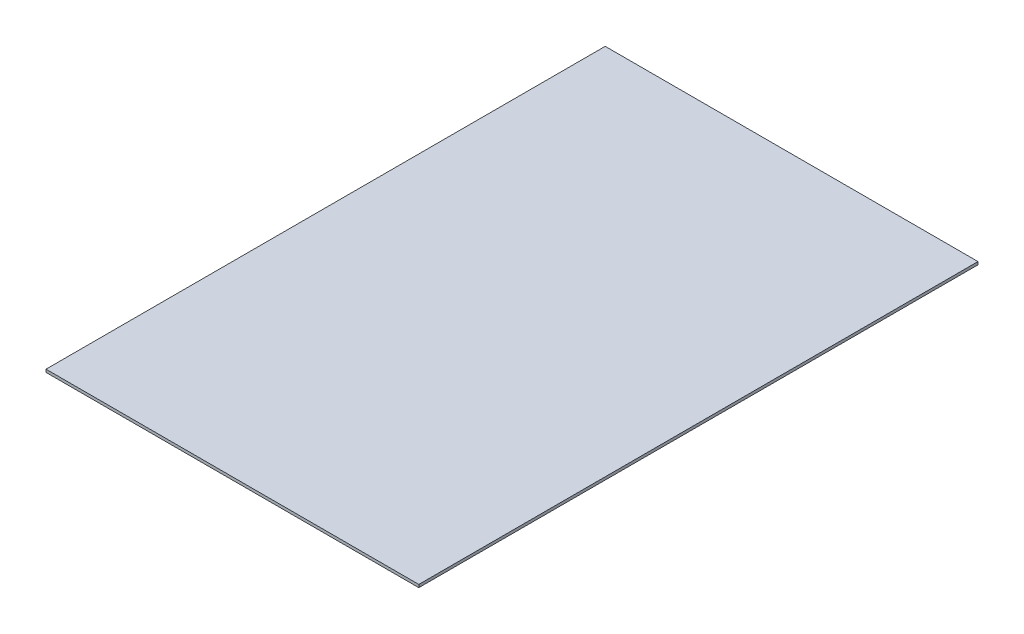
ISO-10303-21;
HEADER;
FILE_DESCRIPTION(('STEP AP214'),'2;1');
FILE_NAME('part.step','',(''),(''),'','','');
FILE_SCHEMA(('AUTOMOTIVE_DESIGN { 1 0 10303 214 1 1 1 1 }'));
ENDSEC;
DATA;
#1=APPLICATION_CONTEXT('core data for automotive mechanical design processes');
#2=APPLICATION_PROTOCOL_DEFINITION('international standard','automotive_design',2000,#1);
#3=PRODUCT_CONTEXT('',#1,'mechanical');
#4=PRODUCT('Part','Part','',(#3));
#5=PRODUCT_RELATED_PRODUCT_CATEGORY('part','',(#4));
#6=PRODUCT_DEFINITION_FORMATION('','',#4);
#7=PRODUCT_DEFINITION_CONTEXT('part definition',#1,'design');
#8=PRODUCT_DEFINITION('design','',#6,#7);
#9=PRODUCT_DEFINITION_SHAPE('','',#8);
#10=(LENGTH_UNIT() NAMED_UNIT(*) SI_UNIT(.MILLI.,.METRE.));
#11=(NAMED_UNIT(*) PLANE_ANGLE_UNIT() SI_UNIT($,.RADIAN.));
#12=(NAMED_UNIT(*) SI_UNIT($,.STERADIAN.) SOLID_ANGLE_UNIT());
#13=UNCERTAINTY_MEASURE_WITH_UNIT(LENGTH_MEASURE(1.E-05),#10,'distance_accuracy_value','');
#14=(GEOMETRIC_REPRESENTATION_CONTEXT(3) GLOBAL_UNCERTAINTY_ASSIGNED_CONTEXT((#13)) GLOBAL_UNIT_ASSIGNED_CONTEXT((#10,
#11,#12)) REPRESENTATION_CONTEXT('',''));
#15=CARTESIAN_POINT('',(0.,0.,0.));
#16=DIRECTION('',(0.,0.,1.));
#17=DIRECTION('',(1.,0.,0.));
#18=AXIS2_PLACEMENT_3D('',#15,#16,#17);
#19=CARTESIAN_POINT('',(0.,1.52,0.));
#20=DIRECTION('',(1.,0.,0.));
#21=DIRECTION('',(0.,0.,-1.));
#22=AXIS2_PLACEMENT_3D('',#19,#20,#21);
#23=PLANE('',#22);
#24=DIRECTION('',(0.,0.,1.));
#25=VECTOR('',#24,1.);
#26=CARTESIAN_POINT('',(0.,0.,0.));
#27=LINE('',#26,#25);
#28=CARTESIAN_POINT('',(0.,0.,-300.));
#29=VERTEX_POINT('',#28);
#30=CARTESIAN_POINT('',(0.,0.,0.));
#31=VERTEX_POINT('',#30);
#32=EDGE_CURVE('E96',#29,#31,#27,.T.);
#33=ORIENTED_EDGE('',*,*,#32,.T.);
#34=DIRECTION('',(0.,-1.,0.));
#35=VECTOR('',#34,1.);
#36=CARTESIAN_POINT('',(0.,1.52,0.));
#37=LINE('',#36,#35);
#38=CARTESIAN_POINT('',(0.,1.52,0.));
#39=VERTEX_POINT('',#38);
#40=EDGE_CURVE('E11',#39,#31,#37,.T.);
#41=ORIENTED_EDGE('',*,*,#40,.F.);
#42=DIRECTION('',(0.,0.,1.));
#43=VECTOR('',#42,1.);
#44=CARTESIAN_POINT('',(0.,1.52,0.));
#45=LINE('',#44,#43);
#46=CARTESIAN_POINT('',(0.,1.52,-300.));
#47=VERTEX_POINT('',#46);
#48=EDGE_CURVE('E84',#47,#39,#45,.T.);
#49=ORIENTED_EDGE('',*,*,#48,.F.);
#50=DIRECTION('',(0.,-1.,0.));
#51=VECTOR('',#50,1.);
#52=CARTESIAN_POINT('',(0.,1.52,-300.));
#53=LINE('',#52,#51);
#54=EDGE_CURVE('E92',#47,#29,#53,.T.);
#55=ORIENTED_EDGE('',*,*,#54,.T.);
#56=EDGE_LOOP('',(#33,#41,#49,#55));
#57=FACE_BOUND('',#56,.T.);
#58=ADVANCED_FACE('F33',(#57),#23,.F.);
#59=CARTESIAN_POINT('',(0.,1.52,0.));
#60=DIRECTION('',(0.,0.,-1.));
#61=DIRECTION('',(-1.,0.,0.));
#62=AXIS2_PLACEMENT_3D('',#59,#60,#61);
#63=PLANE('',#62);
#64=DIRECTION('',(1.,0.,0.));
#65=VECTOR('',#64,1.);
#66=CARTESIAN_POINT('',(0.,0.,0.));
#67=LINE('',#66,#65);
#68=CARTESIAN_POINT('',(200.,0.,0.));
#69=VERTEX_POINT('',#68);
#70=EDGE_CURVE('E88',#31,#69,#67,.T.);
#71=ORIENTED_EDGE('',*,*,#70,.T.);
#72=DIRECTION('',(0.,-1.,0.));
#73=VECTOR('',#72,1.);
#74=CARTESIAN_POINT('',(200.,1.52,0.));
#75=LINE('',#74,#73);
#76=CARTESIAN_POINT('',(200.,1.52,0.));
#77=VERTEX_POINT('',#76);
#78=EDGE_CURVE('E41',#77,#69,#75,.T.);
#79=ORIENTED_EDGE('',*,*,#78,.F.);
#80=DIRECTION('',(1.,0.,0.));
#81=VECTOR('',#80,1.);
#82=CARTESIAN_POINT('',(0.,1.52,0.));
#83=LINE('',#82,#81);
#84=EDGE_CURVE('E79',#39,#77,#83,.T.);
#85=ORIENTED_EDGE('',*,*,#84,.F.);
#86=ORIENTED_EDGE('',*,*,#40,.T.);
#87=EDGE_LOOP('',(#71,#79,#85,#86));
#88=FACE_BOUND('',#87,.T.);
#89=ADVANCED_FACE('F87',(#88),#63,.F.);
#90=CARTESIAN_POINT('',(200.,1.52,0.));
#91=DIRECTION('',(-1.,0.,0.));
#92=DIRECTION('',(0.,0.,1.));
#93=AXIS2_PLACEMENT_3D('',#90,#91,#92);
#94=PLANE('',#93);
#95=DIRECTION('',(0.,0.,-1.));
#96=VECTOR('',#95,1.);
#97=CARTESIAN_POINT('',(200.,0.,0.));
#98=LINE('',#97,#96);
#99=CARTESIAN_POINT('',(200.,0.,-300.));
#100=VERTEX_POINT('',#99);
#101=EDGE_CURVE('E66',#69,#100,#98,.T.);
#102=ORIENTED_EDGE('',*,*,#101,.T.);
#103=DIRECTION('',(0.,-1.,0.));
#104=VECTOR('',#103,1.);
#105=CARTESIAN_POINT('',(200.,1.52,-300.));
#106=LINE('',#105,#104);
#107=CARTESIAN_POINT('',(200.,1.52,-300.));
#108=VERTEX_POINT('',#107);
#109=EDGE_CURVE('E89',#108,#100,#106,.T.);
#110=ORIENTED_EDGE('',*,*,#109,.F.);
#111=DIRECTION('',(0.,0.,-1.));
#112=VECTOR('',#111,1.);
#113=CARTESIAN_POINT('',(200.,1.52,0.));
#114=LINE('',#113,#112);
#115=EDGE_CURVE('E82',#77,#108,#114,.T.);
#116=ORIENTED_EDGE('',*,*,#115,.F.);
#117=ORIENTED_EDGE('',*,*,#78,.T.);
#118=EDGE_LOOP('',(#102,#110,#116,#117));
#119=FACE_BOUND('',#118,.T.);
#120=ADVANCED_FACE('F90',(#119),#94,.F.);
#121=CARTESIAN_POINT('',(0.,1.52,-300.));
#122=DIRECTION('',(0.,0.,1.));
#123=DIRECTION('',(1.,0.,0.));
#124=AXIS2_PLACEMENT_3D('',#121,#122,#123);
#125=PLANE('',#124);
#126=DIRECTION('',(-1.,0.,0.));
#127=VECTOR('',#126,1.);
#128=CARTESIAN_POINT('',(0.,0.,-300.));
#129=LINE('',#128,#127);
#130=EDGE_CURVE('E72',#100,#29,#129,.T.);
#131=ORIENTED_EDGE('',*,*,#130,.T.);
#132=ORIENTED_EDGE('',*,*,#54,.F.);
#133=DIRECTION('',(-1.,0.,0.));
#134=VECTOR('',#133,1.);
#135=CARTESIAN_POINT('',(0.,1.52,-300.));
#136=LINE('',#135,#134);
#137=EDGE_CURVE('E49',#108,#47,#136,.T.);
#138=ORIENTED_EDGE('',*,*,#137,.F.);
#139=ORIENTED_EDGE('',*,*,#109,.T.);
#140=EDGE_LOOP('',(#131,#132,#138,#139));
#141=FACE_BOUND('',#140,.T.);
#142=ADVANCED_FACE('F103',(#141),#125,.F.);
#143=CARTESIAN_POINT('',(0.,1.52,0.));
#144=DIRECTION('',(0.,-1.,0.));
#145=DIRECTION('',(0.,0.,-1.));
#146=AXIS2_PLACEMENT_3D('',#143,#144,#145);
#147=PLANE('',#146);
#148=ORIENTED_EDGE('',*,*,#48,.T.);
#149=ORIENTED_EDGE('',*,*,#84,.T.);
#150=ORIENTED_EDGE('',*,*,#115,.T.);
#151=ORIENTED_EDGE('',*,*,#137,.T.);
#152=EDGE_LOOP('',(#148,#149,#150,#151));
#153=FACE_BOUND('',#152,.T.);
#154=ADVANCED_FACE('F80',(#153),#147,.F.);
#155=CARTESIAN_POINT('',(0.,0.,0.));
#156=DIRECTION('',(0.,-1.,0.));
#157=DIRECTION('',(0.,0.,-1.));
#158=AXIS2_PLACEMENT_3D('',#155,#156,#157);
#159=PLANE('',#158);
#160=ORIENTED_EDGE('',*,*,#32,.F.);
#161=ORIENTED_EDGE('',*,*,#130,.F.);
#162=ORIENTED_EDGE('',*,*,#101,.F.);
#163=ORIENTED_EDGE('',*,*,#70,.F.);
#164=EDGE_LOOP('',(#160,#161,#162,#163));
#165=FACE_BOUND('',#164,.T.);
#166=ADVANCED_FACE('F106',(#165),#159,.T.);
#167=CLOSED_SHELL('',(#58,#89,#120,#142,#154,#166));
#168=MANIFOLD_SOLID_BREP('B2',#167);
#169=ADVANCED_BREP_SHAPE_REPRESENTATION('',(#18,#168),#14);
#170=SHAPE_DEFINITION_REPRESENTATION(#9,#169);
ENDSEC;
END-ISO-10303-21;
